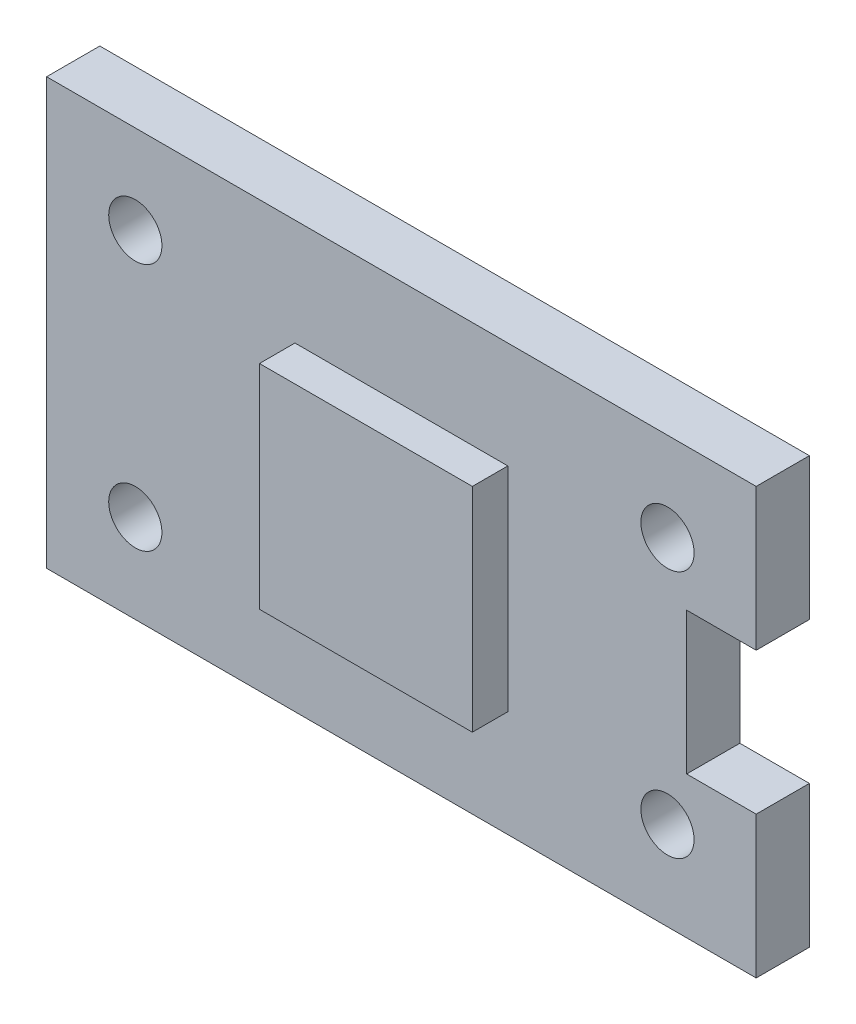
ISO-10303-21;
HEADER;
FILE_DESCRIPTION(('STEP AP214'),'2;1');
FILE_NAME('part.step','',(''),(''),'','','');
FILE_SCHEMA(('AUTOMOTIVE_DESIGN { 1 0 10303 214 1 1 1 1 }'));
ENDSEC;
DATA;
#1=APPLICATION_CONTEXT('core data for automotive mechanical design processes');
#2=APPLICATION_PROTOCOL_DEFINITION('international standard','automotive_design',2000,#1);
#3=PRODUCT_CONTEXT('',#1,'mechanical');
#4=PRODUCT('Part','Part','',(#3));
#5=PRODUCT_RELATED_PRODUCT_CATEGORY('part','',(#4));
#6=PRODUCT_DEFINITION_FORMATION('','',#4);
#7=PRODUCT_DEFINITION_CONTEXT('part definition',#1,'design');
#8=PRODUCT_DEFINITION('design','',#6,#7);
#9=PRODUCT_DEFINITION_SHAPE('','',#8);
#10=(LENGTH_UNIT() NAMED_UNIT(*) SI_UNIT(.MILLI.,.METRE.));
#11=(NAMED_UNIT(*) PLANE_ANGLE_UNIT() SI_UNIT($,.RADIAN.));
#12=(NAMED_UNIT(*) SI_UNIT($,.STERADIAN.) SOLID_ANGLE_UNIT());
#13=UNCERTAINTY_MEASURE_WITH_UNIT(LENGTH_MEASURE(1.E-05),#10,'distance_accuracy_value','');
#14=(GEOMETRIC_REPRESENTATION_CONTEXT(3) GLOBAL_UNCERTAINTY_ASSIGNED_CONTEXT((#13)) GLOBAL_UNIT_ASSIGNED_CONTEXT((#10,
#11,#12)) REPRESENTATION_CONTEXT('',''));
#15=CARTESIAN_POINT('',(0.,0.,0.));
#16=DIRECTION('',(0.,0.,1.));
#17=DIRECTION('',(1.,0.,0.));
#18=AXIS2_PLACEMENT_3D('',#15,#16,#17);
#19=CARTESIAN_POINT('',(0.,0.,9.525));
#20=DIRECTION('',(0.,0.,-1.));
#21=DIRECTION('',(-1.,0.,0.));
#22=AXIS2_PLACEMENT_3D('',#19,#20,#21);
#23=PLANE('',#22);
#24=CARTESIAN_POINT('',(111.125,60.325,9.525));
#25=DIRECTION('',(0.,0.,-1.));
#26=DIRECTION('',(-1.,0.,0.));
#27=AXIS2_PLACEMENT_3D('',#24,#25,#26);
#28=CIRCLE('',#27,4.7625);
#29=CARTESIAN_POINT('',(106.3625,60.325,9.525));
#30=VERTEX_POINT('',#29);
#31=EDGE_CURVE('E416',#30,#30,#28,.F.);
#32=ORIENTED_EDGE('',*,*,#31,.F.);
#33=EDGE_LOOP('',(#32));
#34=FACE_BOUND('',#33,.T.);
#35=CARTESIAN_POINT('',(15.875,60.325,9.525));
#36=DIRECTION('',(0.,0.,-1.));
#37=DIRECTION('',(-1.,0.,0.));
#38=AXIS2_PLACEMENT_3D('',#35,#36,#37);
#39=CIRCLE('',#38,4.7625);
#40=CARTESIAN_POINT('',(11.1125,60.325,9.525));
#41=VERTEX_POINT('',#40);
#42=EDGE_CURVE('E423',#41,#41,#39,.F.);
#43=ORIENTED_EDGE('',*,*,#42,.F.);
#44=EDGE_LOOP('',(#43));
#45=FACE_BOUND('',#44,.T.);
#46=CARTESIAN_POINT('',(111.125,15.875,9.525));
#47=DIRECTION('',(0.,0.,-1.));
#48=DIRECTION('',(-1.,0.,0.));
#49=AXIS2_PLACEMENT_3D('',#46,#47,#48);
#50=CIRCLE('',#49,4.7625);
#51=CARTESIAN_POINT('',(106.3625,15.875,9.525));
#52=VERTEX_POINT('',#51);
#53=EDGE_CURVE('E427',#52,#52,#50,.F.);
#54=ORIENTED_EDGE('',*,*,#53,.F.);
#55=EDGE_LOOP('',(#54));
#56=FACE_BOUND('',#55,.T.);
#57=CARTESIAN_POINT('',(15.875,15.875,9.525));
#58=DIRECTION('',(0.,0.,-1.));
#59=DIRECTION('',(-1.,0.,0.));
#60=AXIS2_PLACEMENT_3D('',#57,#58,#59);
#61=CIRCLE('',#60,4.7625);
#62=CARTESIAN_POINT('',(11.1125,15.875,9.525));
#63=VERTEX_POINT('',#62);
#64=EDGE_CURVE('E141',#63,#63,#61,.F.);
#65=ORIENTED_EDGE('',*,*,#64,.F.);
#66=EDGE_LOOP('',(#65));
#67=FACE_BOUND('',#66,.T.);
#68=DIRECTION('',(0.,-1.,0.));
#69=VECTOR('',#68,1.);
#70=CARTESIAN_POINT('',(44.45,19.05,9.525));
#71=LINE('',#70,#69);
#72=CARTESIAN_POINT('',(44.45,57.15,9.525));
#73=VERTEX_POINT('',#72);
#74=CARTESIAN_POINT('',(44.45,19.05,9.525));
#75=VERTEX_POINT('',#74);
#76=EDGE_CURVE('E62',#73,#75,#71,.T.);
#77=ORIENTED_EDGE('',*,*,#76,.F.);
#78=DIRECTION('',(-1.,0.,0.));
#79=VECTOR('',#78,1.);
#80=CARTESIAN_POINT('',(44.45,57.15,9.525));
#81=LINE('',#80,#79);
#82=CARTESIAN_POINT('',(82.55,57.15,9.525));
#83=VERTEX_POINT('',#82);
#84=EDGE_CURVE('E168',#83,#73,#81,.T.);
#85=ORIENTED_EDGE('',*,*,#84,.F.);
#86=DIRECTION('',(0.,1.,0.));
#87=VECTOR('',#86,1.);
#88=CARTESIAN_POINT('',(82.55,19.05,9.525));
#89=LINE('',#88,#87);
#90=CARTESIAN_POINT('',(82.55,19.05,9.525));
#91=VERTEX_POINT('',#90);
#92=EDGE_CURVE('E180',#91,#83,#89,.T.);
#93=ORIENTED_EDGE('',*,*,#92,.F.);
#94=DIRECTION('',(1.,0.,0.));
#95=VECTOR('',#94,1.);
#96=CARTESIAN_POINT('',(44.45,19.05,9.525));
#97=LINE('',#96,#95);
#98=EDGE_CURVE('E172',#75,#91,#97,.T.);
#99=ORIENTED_EDGE('',*,*,#98,.F.);
#100=EDGE_LOOP('',(#77,#85,#93,#99));
#101=FACE_BOUND('',#100,.T.);
#102=DIRECTION('',(1.,0.,0.));
#103=VECTOR('',#102,1.);
#104=CARTESIAN_POINT('',(0.,25.4,9.525));
#105=LINE('',#104,#103);
#106=CARTESIAN_POINT('',(114.554,25.4,9.525));
#107=VERTEX_POINT('',#106);
#108=CARTESIAN_POINT('',(127.,25.4,9.525));
#109=VERTEX_POINT('',#108);
#110=EDGE_CURVE('E157',#107,#109,#105,.T.);
#111=ORIENTED_EDGE('',*,*,#110,.F.);
#112=DIRECTION('',(0.,-1.,0.));
#113=VECTOR('',#112,1.);
#114=CARTESIAN_POINT('',(114.554,0.,9.525));
#115=LINE('',#114,#113);
#116=CARTESIAN_POINT('',(114.554,50.8,9.525));
#117=VERTEX_POINT('',#116);
#118=EDGE_CURVE('E156',#117,#107,#115,.T.);
#119=ORIENTED_EDGE('',*,*,#118,.F.);
#120=DIRECTION('',(-1.,0.,0.));
#121=VECTOR('',#120,1.);
#122=CARTESIAN_POINT('',(0.,50.8,9.525));
#123=LINE('',#122,#121);
#124=CARTESIAN_POINT('',(127.,50.8,9.525));
#125=VERTEX_POINT('',#124);
#126=EDGE_CURVE('E131',#125,#117,#123,.T.);
#127=ORIENTED_EDGE('',*,*,#126,.F.);
#128=DIRECTION('',(0.,1.,0.));
#129=VECTOR('',#128,1.);
#130=CARTESIAN_POINT('',(127.,0.,9.525));
#131=LINE('',#130,#129);
#132=CARTESIAN_POINT('',(127.,76.2,9.525));
#133=VERTEX_POINT('',#132);
#134=EDGE_CURVE('E196',#125,#133,#131,.T.);
#135=ORIENTED_EDGE('',*,*,#134,.T.);
#136=DIRECTION('',(-1.,0.,0.));
#137=VECTOR('',#136,1.);
#138=CARTESIAN_POINT('',(0.,76.2,9.525));
#139=LINE('',#138,#137);
#140=CARTESIAN_POINT('',(0.,76.2,9.525));
#141=VERTEX_POINT('',#140);
#142=EDGE_CURVE('E205',#133,#141,#139,.T.);
#143=ORIENTED_EDGE('',*,*,#142,.T.);
#144=DIRECTION('',(0.,-1.,0.));
#145=VECTOR('',#144,1.);
#146=CARTESIAN_POINT('',(0.,0.,9.525));
#147=LINE('',#146,#145);
#148=CARTESIAN_POINT('',(0.,0.,9.525));
#149=VERTEX_POINT('',#148);
#150=EDGE_CURVE('E194',#141,#149,#147,.T.);
#151=ORIENTED_EDGE('',*,*,#150,.T.);
#152=DIRECTION('',(1.,0.,0.));
#153=VECTOR('',#152,1.);
#154=CARTESIAN_POINT('',(0.,0.,9.525));
#155=LINE('',#154,#153);
#156=CARTESIAN_POINT('',(127.,0.,9.525));
#157=VERTEX_POINT('',#156);
#158=EDGE_CURVE('E197',#149,#157,#155,.T.);
#159=ORIENTED_EDGE('',*,*,#158,.T.);
#160=EDGE_CURVE('E198',#157,#109,#131,.T.);
#161=ORIENTED_EDGE('',*,*,#160,.T.);
#162=EDGE_LOOP('',(#111,#119,#127,#135,#143,#151,#159,#161));
#163=FACE_BOUND('',#162,.T.);
#164=ADVANCED_FACE('F39',(#34,#45,#56,#67,#101,#163),#23,.F.);
#165=CARTESIAN_POINT('',(127.,0.,9.525));
#166=DIRECTION('',(-1.,0.,0.));
#167=DIRECTION('',(0.,0.,1.));
#168=AXIS2_PLACEMENT_3D('',#165,#166,#167);
#169=PLANE('',#168);
#170=DIRECTION('',(0.,0.,-1.));
#171=VECTOR('',#170,1.);
#172=CARTESIAN_POINT('',(127.,25.4,9.525));
#173=LINE('',#172,#171);
#174=CARTESIAN_POINT('',(127.,25.4,0.));
#175=VERTEX_POINT('',#174);
#176=EDGE_CURVE('E11',#109,#175,#173,.T.);
#177=ORIENTED_EDGE('',*,*,#176,.F.);
#178=ORIENTED_EDGE('',*,*,#160,.F.);
#179=DIRECTION('',(0.,0.,-1.));
#180=VECTOR('',#179,1.);
#181=CARTESIAN_POINT('',(127.,0.,9.525));
#182=LINE('',#181,#180);
#183=CARTESIAN_POINT('',(127.,0.,0.));
#184=VERTEX_POINT('',#183);
#185=EDGE_CURVE('E155',#157,#184,#182,.T.);
#186=ORIENTED_EDGE('',*,*,#185,.T.);
#187=DIRECTION('',(0.,1.,0.));
#188=VECTOR('',#187,1.);
#189=CARTESIAN_POINT('',(127.,0.,0.));
#190=LINE('',#189,#188);
#191=EDGE_CURVE('E208',#184,#175,#190,.T.);
#192=ORIENTED_EDGE('',*,*,#191,.T.);
#193=EDGE_LOOP('',(#177,#178,#186,#192));
#194=FACE_BOUND('',#193,.T.);
#195=ADVANCED_FACE('F222',(#194),#169,.F.);
#196=DIRECTION('',(0.,0.,1.));
#197=VECTOR('',#196,1.);
#198=CARTESIAN_POINT('',(127.,50.8,9.525));
#199=LINE('',#198,#197);
#200=CARTESIAN_POINT('',(127.,50.8,0.));
#201=VERTEX_POINT('',#200);
#202=EDGE_CURVE('E50',#201,#125,#199,.T.);
#203=ORIENTED_EDGE('',*,*,#202,.F.);
#204=CARTESIAN_POINT('',(127.,76.2,0.));
#205=VERTEX_POINT('',#204);
#206=EDGE_CURVE('E149',#201,#205,#190,.T.);
#207=ORIENTED_EDGE('',*,*,#206,.T.);
#208=DIRECTION('',(0.,0.,-1.));
#209=VECTOR('',#208,1.);
#210=CARTESIAN_POINT('',(127.,76.2,9.525));
#211=LINE('',#210,#209);
#212=EDGE_CURVE('E217',#133,#205,#211,.T.);
#213=ORIENTED_EDGE('',*,*,#212,.F.);
#214=ORIENTED_EDGE('',*,*,#134,.F.);
#215=EDGE_LOOP('',(#203,#207,#213,#214));
#216=FACE_BOUND('',#215,.T.);
#217=ADVANCED_FACE('F237',(#216),#169,.F.);
#218=CARTESIAN_POINT('',(0.,0.,0.));
#219=DIRECTION('',(0.,0.,-1.));
#220=DIRECTION('',(-1.,0.,0.));
#221=AXIS2_PLACEMENT_3D('',#218,#219,#220);
#222=PLANE('',#221);
#223=CARTESIAN_POINT('',(111.125,60.325,0.));
#224=DIRECTION('',(0.,0.,1.));
#225=DIRECTION('',(1.,0.,0.));
#226=AXIS2_PLACEMENT_3D('',#223,#224,#225);
#227=CIRCLE('',#226,4.7625);
#228=CARTESIAN_POINT('',(115.8875,60.325,0.));
#229=VERTEX_POINT('',#228);
#230=EDGE_CURVE('E413',#229,#229,#227,.T.);
#231=ORIENTED_EDGE('',*,*,#230,.T.);
#232=EDGE_LOOP('',(#231));
#233=FACE_BOUND('',#232,.T.);
#234=CARTESIAN_POINT('',(15.875,60.325,0.));
#235=DIRECTION('',(0.,0.,1.));
#236=DIRECTION('',(1.,0.,0.));
#237=AXIS2_PLACEMENT_3D('',#234,#235,#236);
#238=CIRCLE('',#237,4.7625);
#239=CARTESIAN_POINT('',(20.6375,60.325,0.));
#240=VERTEX_POINT('',#239);
#241=EDGE_CURVE('E420',#240,#240,#238,.T.);
#242=ORIENTED_EDGE('',*,*,#241,.T.);
#243=EDGE_LOOP('',(#242));
#244=FACE_BOUND('',#243,.T.);
#245=CARTESIAN_POINT('',(111.125,15.875,0.));
#246=DIRECTION('',(0.,0.,1.));
#247=DIRECTION('',(1.,0.,0.));
#248=AXIS2_PLACEMENT_3D('',#245,#246,#247);
#249=CIRCLE('',#248,4.7625);
#250=CARTESIAN_POINT('',(115.8875,15.875,0.));
#251=VERTEX_POINT('',#250);
#252=EDGE_CURVE('E430',#251,#251,#249,.T.);
#253=ORIENTED_EDGE('',*,*,#252,.T.);
#254=EDGE_LOOP('',(#253));
#255=FACE_BOUND('',#254,.T.);
#256=CARTESIAN_POINT('',(15.875,15.875,0.));
#257=DIRECTION('',(0.,0.,1.));
#258=DIRECTION('',(1.,0.,0.));
#259=AXIS2_PLACEMENT_3D('',#256,#257,#258);
#260=CIRCLE('',#259,4.7625);
#261=CARTESIAN_POINT('',(20.6375,15.875,0.));
#262=VERTEX_POINT('',#261);
#263=EDGE_CURVE('E433',#262,#262,#260,.T.);
#264=ORIENTED_EDGE('',*,*,#263,.T.);
#265=EDGE_LOOP('',(#264));
#266=FACE_BOUND('',#265,.T.);
#267=ORIENTED_EDGE('',*,*,#206,.F.);
#268=DIRECTION('',(-1.,0.,0.));
#269=VECTOR('',#268,1.);
#270=CARTESIAN_POINT('',(114.554,50.8,0.));
#271=LINE('',#270,#269);
#272=CARTESIAN_POINT('',(114.554,50.8,0.));
#273=VERTEX_POINT('',#272);
#274=EDGE_CURVE('E132',#201,#273,#271,.T.);
#275=ORIENTED_EDGE('',*,*,#274,.T.);
#276=DIRECTION('',(0.,-1.,0.));
#277=VECTOR('',#276,1.);
#278=CARTESIAN_POINT('',(114.554,25.4,0.));
#279=LINE('',#278,#277);
#280=CARTESIAN_POINT('',(114.554,25.4,0.));
#281=VERTEX_POINT('',#280);
#282=EDGE_CURVE('E137',#273,#281,#279,.T.);
#283=ORIENTED_EDGE('',*,*,#282,.T.);
#284=DIRECTION('',(1.,0.,0.));
#285=VECTOR('',#284,1.);
#286=CARTESIAN_POINT('',(114.554,25.4,0.));
#287=LINE('',#286,#285);
#288=EDGE_CURVE('E52',#281,#175,#287,.T.);
#289=ORIENTED_EDGE('',*,*,#288,.T.);
#290=ORIENTED_EDGE('',*,*,#191,.F.);
#291=DIRECTION('',(1.,0.,0.));
#292=VECTOR('',#291,1.);
#293=CARTESIAN_POINT('',(0.,0.,0.));
#294=LINE('',#293,#292);
#295=CARTESIAN_POINT('',(0.,0.,0.));
#296=VERTEX_POINT('',#295);
#297=EDGE_CURVE('E206',#296,#184,#294,.T.);
#298=ORIENTED_EDGE('',*,*,#297,.F.);
#299=DIRECTION('',(0.,-1.,0.));
#300=VECTOR('',#299,1.);
#301=CARTESIAN_POINT('',(0.,0.,0.));
#302=LINE('',#301,#300);
#303=CARTESIAN_POINT('',(0.,76.2,0.));
#304=VERTEX_POINT('',#303);
#305=EDGE_CURVE('E195',#304,#296,#302,.T.);
#306=ORIENTED_EDGE('',*,*,#305,.F.);
#307=DIRECTION('',(-1.,0.,0.));
#308=VECTOR('',#307,1.);
#309=CARTESIAN_POINT('',(0.,76.2,0.));
#310=LINE('',#309,#308);
#311=EDGE_CURVE('E200',#205,#304,#310,.T.);
#312=ORIENTED_EDGE('',*,*,#311,.F.);
#313=EDGE_LOOP('',(#267,#275,#283,#289,#290,#298,#306,#312));
#314=FACE_BOUND('',#313,.T.);
#315=ADVANCED_FACE('F147',(#233,#244,#255,#266,#314),#222,.T.);
#316=CARTESIAN_POINT('',(0.,0.,9.525));
#317=DIRECTION('',(1.,0.,0.));
#318=DIRECTION('',(0.,0.,-1.));
#319=AXIS2_PLACEMENT_3D('',#316,#317,#318);
#320=PLANE('',#319);
#321=ORIENTED_EDGE('',*,*,#305,.T.);
#322=DIRECTION('',(0.,0.,-1.));
#323=VECTOR('',#322,1.);
#324=CARTESIAN_POINT('',(0.,0.,9.525));
#325=LINE('',#324,#323);
#326=EDGE_CURVE('E146',#149,#296,#325,.T.);
#327=ORIENTED_EDGE('',*,*,#326,.F.);
#328=ORIENTED_EDGE('',*,*,#150,.F.);
#329=DIRECTION('',(0.,0.,-1.));
#330=VECTOR('',#329,1.);
#331=CARTESIAN_POINT('',(0.,76.2,9.525));
#332=LINE('',#331,#330);
#333=EDGE_CURVE('E202',#141,#304,#332,.T.);
#334=ORIENTED_EDGE('',*,*,#333,.T.);
#335=EDGE_LOOP('',(#321,#327,#328,#334));
#336=FACE_BOUND('',#335,.T.);
#337=ADVANCED_FACE('F41',(#336),#320,.F.);
#338=CARTESIAN_POINT('',(0.,0.,9.525));
#339=DIRECTION('',(0.,1.,0.));
#340=DIRECTION('',(0.,0.,1.));
#341=AXIS2_PLACEMENT_3D('',#338,#339,#340);
#342=PLANE('',#341);
#343=ORIENTED_EDGE('',*,*,#297,.T.);
#344=ORIENTED_EDGE('',*,*,#185,.F.);
#345=ORIENTED_EDGE('',*,*,#158,.F.);
#346=ORIENTED_EDGE('',*,*,#326,.T.);
#347=EDGE_LOOP('',(#343,#344,#345,#346));
#348=FACE_BOUND('',#347,.T.);
#349=ADVANCED_FACE('F230',(#348),#342,.F.);
#350=CARTESIAN_POINT('',(0.,76.2,9.525));
#351=DIRECTION('',(0.,-1.,0.));
#352=DIRECTION('',(0.,0.,-1.));
#353=AXIS2_PLACEMENT_3D('',#350,#351,#352);
#354=PLANE('',#353);
#355=ORIENTED_EDGE('',*,*,#311,.T.);
#356=ORIENTED_EDGE('',*,*,#333,.F.);
#357=ORIENTED_EDGE('',*,*,#142,.F.);
#358=ORIENTED_EDGE('',*,*,#212,.T.);
#359=EDGE_LOOP('',(#355,#356,#357,#358));
#360=FACE_BOUND('',#359,.T.);
#361=ADVANCED_FACE('F232',(#360),#354,.F.);
#362=CARTESIAN_POINT('',(44.45,19.05,15.875));
#363=DIRECTION('',(1.,0.,0.));
#364=DIRECTION('',(0.,0.,-1.));
#365=AXIS2_PLACEMENT_3D('',#362,#363,#364);
#366=PLANE('',#365);
#367=ORIENTED_EDGE('',*,*,#76,.T.);
#368=DIRECTION('',(0.,0.,-1.));
#369=VECTOR('',#368,1.);
#370=CARTESIAN_POINT('',(44.45,19.05,15.875));
#371=LINE('',#370,#369);
#372=CARTESIAN_POINT('',(44.45,19.05,15.875));
#373=VERTEX_POINT('',#372);
#374=EDGE_CURVE('E186',#373,#75,#371,.T.);
#375=ORIENTED_EDGE('',*,*,#374,.F.);
#376=DIRECTION('',(0.,-1.,0.));
#377=VECTOR('',#376,1.);
#378=CARTESIAN_POINT('',(44.45,19.05,15.875));
#379=LINE('',#378,#377);
#380=CARTESIAN_POINT('',(44.45,57.15,15.875));
#381=VERTEX_POINT('',#380);
#382=EDGE_CURVE('E162',#381,#373,#379,.T.);
#383=ORIENTED_EDGE('',*,*,#382,.F.);
#384=DIRECTION('',(0.,0.,-1.));
#385=VECTOR('',#384,1.);
#386=CARTESIAN_POINT('',(44.45,57.15,15.875));
#387=LINE('',#386,#385);
#388=EDGE_CURVE('E175',#381,#73,#387,.T.);
#389=ORIENTED_EDGE('',*,*,#388,.T.);
#390=EDGE_LOOP('',(#367,#375,#383,#389));
#391=FACE_BOUND('',#390,.T.);
#392=ADVANCED_FACE('F268',(#391),#366,.F.);
#393=CARTESIAN_POINT('',(44.45,19.05,15.875));
#394=DIRECTION('',(0.,1.,0.));
#395=DIRECTION('',(0.,0.,1.));
#396=AXIS2_PLACEMENT_3D('',#393,#394,#395);
#397=PLANE('',#396);
#398=ORIENTED_EDGE('',*,*,#98,.T.);
#399=DIRECTION('',(0.,0.,-1.));
#400=VECTOR('',#399,1.);
#401=CARTESIAN_POINT('',(82.55,19.05,15.875));
#402=LINE('',#401,#400);
#403=CARTESIAN_POINT('',(82.55,19.05,15.875));
#404=VERTEX_POINT('',#403);
#405=EDGE_CURVE('E187',#404,#91,#402,.T.);
#406=ORIENTED_EDGE('',*,*,#405,.F.);
#407=DIRECTION('',(1.,0.,0.));
#408=VECTOR('',#407,1.);
#409=CARTESIAN_POINT('',(44.45,19.05,15.875));
#410=LINE('',#409,#408);
#411=EDGE_CURVE('E164',#373,#404,#410,.T.);
#412=ORIENTED_EDGE('',*,*,#411,.F.);
#413=ORIENTED_EDGE('',*,*,#374,.T.);
#414=EDGE_LOOP('',(#398,#406,#412,#413));
#415=FACE_BOUND('',#414,.T.);
#416=ADVANCED_FACE('F297',(#415),#397,.F.);
#417=CARTESIAN_POINT('',(82.55,19.05,15.875));
#418=DIRECTION('',(-1.,0.,0.));
#419=DIRECTION('',(0.,0.,1.));
#420=AXIS2_PLACEMENT_3D('',#417,#418,#419);
#421=PLANE('',#420);
#422=ORIENTED_EDGE('',*,*,#92,.T.);
#423=DIRECTION('',(0.,0.,-1.));
#424=VECTOR('',#423,1.);
#425=CARTESIAN_POINT('',(82.55,57.15,15.875));
#426=LINE('',#425,#424);
#427=CARTESIAN_POINT('',(82.55,57.15,15.875));
#428=VERTEX_POINT('',#427);
#429=EDGE_CURVE('E182',#428,#83,#426,.T.);
#430=ORIENTED_EDGE('',*,*,#429,.F.);
#431=DIRECTION('',(0.,1.,0.));
#432=VECTOR('',#431,1.);
#433=CARTESIAN_POINT('',(82.55,19.05,15.875));
#434=LINE('',#433,#432);
#435=EDGE_CURVE('E166',#404,#428,#434,.T.);
#436=ORIENTED_EDGE('',*,*,#435,.F.);
#437=ORIENTED_EDGE('',*,*,#405,.T.);
#438=EDGE_LOOP('',(#422,#430,#436,#437));
#439=FACE_BOUND('',#438,.T.);
#440=ADVANCED_FACE('F307',(#439),#421,.F.);
#441=CARTESIAN_POINT('',(44.45,57.15,15.875));
#442=DIRECTION('',(0.,-1.,0.));
#443=DIRECTION('',(0.,0.,-1.));
#444=AXIS2_PLACEMENT_3D('',#441,#442,#443);
#445=PLANE('',#444);
#446=ORIENTED_EDGE('',*,*,#84,.T.);
#447=ORIENTED_EDGE('',*,*,#388,.F.);
#448=DIRECTION('',(-1.,0.,0.));
#449=VECTOR('',#448,1.);
#450=CARTESIAN_POINT('',(44.45,57.15,15.875));
#451=LINE('',#450,#449);
#452=EDGE_CURVE('E167',#428,#381,#451,.T.);
#453=ORIENTED_EDGE('',*,*,#452,.F.);
#454=ORIENTED_EDGE('',*,*,#429,.T.);
#455=EDGE_LOOP('',(#446,#447,#453,#454));
#456=FACE_BOUND('',#455,.T.);
#457=ADVANCED_FACE('F255',(#456),#445,.F.);
#458=CARTESIAN_POINT('',(0.,0.,15.875));
#459=DIRECTION('',(0.,0.,-1.));
#460=DIRECTION('',(-1.,0.,0.));
#461=AXIS2_PLACEMENT_3D('',#458,#459,#460);
#462=PLANE('',#461);
#463=ORIENTED_EDGE('',*,*,#382,.T.);
#464=ORIENTED_EDGE('',*,*,#411,.T.);
#465=ORIENTED_EDGE('',*,*,#435,.T.);
#466=ORIENTED_EDGE('',*,*,#452,.T.);
#467=EDGE_LOOP('',(#463,#464,#465,#466));
#468=FACE_BOUND('',#467,.T.);
#469=ADVANCED_FACE('F242',(#468),#462,.F.);
#470=CARTESIAN_POINT('',(114.554,25.4,15.875));
#471=DIRECTION('',(0.,1.,0.));
#472=DIRECTION('',(0.,0.,1.));
#473=AXIS2_PLACEMENT_3D('',#470,#471,#472);
#474=PLANE('',#473);
#475=ORIENTED_EDGE('',*,*,#110,.T.);
#476=ORIENTED_EDGE('',*,*,#176,.T.);
#477=ORIENTED_EDGE('',*,*,#288,.F.);
#478=DIRECTION('',(0.,0.,-1.));
#479=VECTOR('',#478,1.);
#480=CARTESIAN_POINT('',(114.554,25.4,15.875));
#481=LINE('',#480,#479);
#482=EDGE_CURVE('E136',#107,#281,#481,.T.);
#483=ORIENTED_EDGE('',*,*,#482,.F.);
#484=EDGE_LOOP('',(#475,#476,#477,#483));
#485=FACE_BOUND('',#484,.T.);
#486=ADVANCED_FACE('F245',(#485),#474,.T.);
#487=CARTESIAN_POINT('',(114.554,50.8,15.875));
#488=DIRECTION('',(0.,-1.,0.));
#489=DIRECTION('',(0.,0.,-1.));
#490=AXIS2_PLACEMENT_3D('',#487,#488,#489);
#491=PLANE('',#490);
#492=ORIENTED_EDGE('',*,*,#126,.T.);
#493=DIRECTION('',(0.,0.,-1.));
#494=VECTOR('',#493,1.);
#495=CARTESIAN_POINT('',(114.554,50.8,15.875));
#496=LINE('',#495,#494);
#497=EDGE_CURVE('E130',#117,#273,#496,.T.);
#498=ORIENTED_EDGE('',*,*,#497,.T.);
#499=ORIENTED_EDGE('',*,*,#274,.F.);
#500=ORIENTED_EDGE('',*,*,#202,.T.);
#501=EDGE_LOOP('',(#492,#498,#499,#500));
#502=FACE_BOUND('',#501,.T.);
#503=ADVANCED_FACE('F126',(#502),#491,.T.);
#504=CARTESIAN_POINT('',(114.554,25.4,15.875));
#505=DIRECTION('',(1.,0.,0.));
#506=DIRECTION('',(0.,0.,-1.));
#507=AXIS2_PLACEMENT_3D('',#504,#505,#506);
#508=PLANE('',#507);
#509=ORIENTED_EDGE('',*,*,#118,.T.);
#510=ORIENTED_EDGE('',*,*,#482,.T.);
#511=ORIENTED_EDGE('',*,*,#282,.F.);
#512=ORIENTED_EDGE('',*,*,#497,.F.);
#513=EDGE_LOOP('',(#509,#510,#511,#512));
#514=FACE_BOUND('',#513,.T.);
#515=ADVANCED_FACE('F142',(#514),#508,.T.);
#516=CARTESIAN_POINT('',(15.875,15.875,15.875));
#517=DIRECTION('',(0.,0.,-1.));
#518=DIRECTION('',(-1.,0.,0.));
#519=AXIS2_PLACEMENT_3D('',#516,#517,#518);
#520=CYLINDRICAL_SURFACE('',#519,4.7625);
#521=ORIENTED_EDGE('',*,*,#263,.F.);
#522=EDGE_LOOP('',(#521));
#523=FACE_BOUND('',#522,.T.);
#524=ORIENTED_EDGE('',*,*,#64,.T.);
#525=EDGE_LOOP('',(#524));
#526=FACE_BOUND('',#525,.T.);
#527=ADVANCED_FACE('F371',(#523,#526),#520,.F.);
#528=CARTESIAN_POINT('',(111.125,15.875,15.875));
#529=DIRECTION('',(0.,0.,-1.));
#530=DIRECTION('',(-1.,0.,0.));
#531=AXIS2_PLACEMENT_3D('',#528,#529,#530);
#532=CYLINDRICAL_SURFACE('',#531,4.7625);
#533=ORIENTED_EDGE('',*,*,#252,.F.);
#534=EDGE_LOOP('',(#533));
#535=FACE_BOUND('',#534,.T.);
#536=ORIENTED_EDGE('',*,*,#53,.T.);
#537=EDGE_LOOP('',(#536));
#538=FACE_BOUND('',#537,.T.);
#539=ADVANCED_FACE('F378',(#535,#538),#532,.F.);
#540=CARTESIAN_POINT('',(15.875,60.325,15.875));
#541=DIRECTION('',(0.,0.,-1.));
#542=DIRECTION('',(-1.,0.,0.));
#543=AXIS2_PLACEMENT_3D('',#540,#541,#542);
#544=CYLINDRICAL_SURFACE('',#543,4.7625);
#545=ORIENTED_EDGE('',*,*,#241,.F.);
#546=EDGE_LOOP('',(#545));
#547=FACE_BOUND('',#546,.T.);
#548=ORIENTED_EDGE('',*,*,#42,.T.);
#549=EDGE_LOOP('',(#548));
#550=FACE_BOUND('',#549,.T.);
#551=ADVANCED_FACE('F386',(#547,#550),#544,.F.);
#552=CARTESIAN_POINT('',(111.125,60.325,15.875));
#553=DIRECTION('',(0.,0.,-1.));
#554=DIRECTION('',(-1.,0.,0.));
#555=AXIS2_PLACEMENT_3D('',#552,#553,#554);
#556=CYLINDRICAL_SURFACE('',#555,4.7625);
#557=ORIENTED_EDGE('',*,*,#230,.F.);
#558=EDGE_LOOP('',(#557));
#559=FACE_BOUND('',#558,.T.);
#560=ORIENTED_EDGE('',*,*,#31,.T.);
#561=EDGE_LOOP('',(#560));
#562=FACE_BOUND('',#561,.T.);
#563=ADVANCED_FACE('F400',(#559,#562),#556,.F.);
#564=CLOSED_SHELL('',(#164,#195,#217,#315,#337,#349,#361,#392,#416,#440,#457,#469,#486,#503,
#515,#527,#539,#551,#563));
#565=MANIFOLD_SOLID_BREP('B2',#564);
#566=ADVANCED_BREP_SHAPE_REPRESENTATION('',(#18,#565),#14);
#567=SHAPE_DEFINITION_REPRESENTATION(#9,#566);
ENDSEC;
END-ISO-10303-21;
